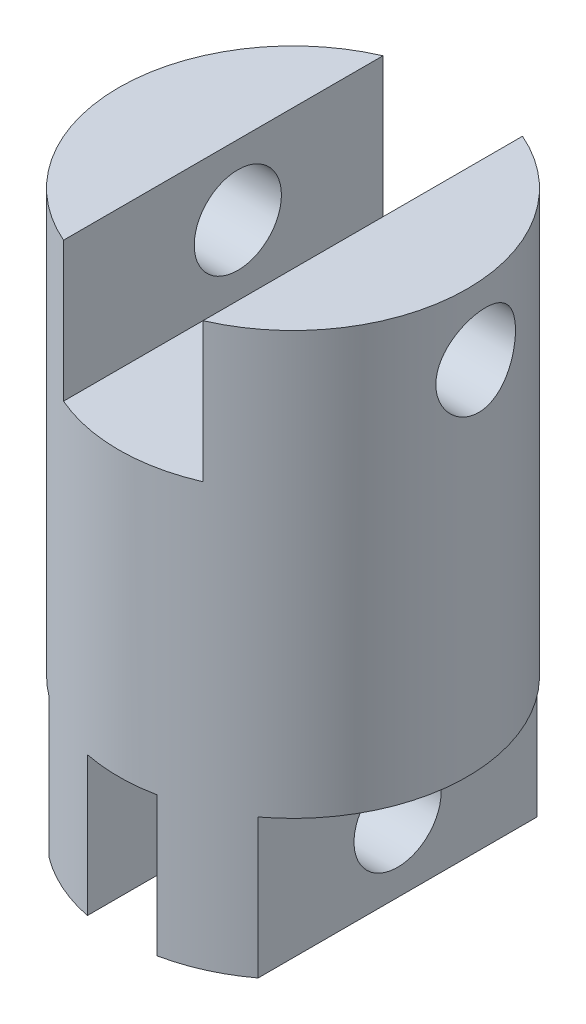
ISO-10303-21;
HEADER;
FILE_DESCRIPTION(('STEP AP214'),'2;1');
FILE_NAME('part.step','',(''),(''),'','','');
FILE_SCHEMA(('AUTOMOTIVE_DESIGN { 1 0 10303 214 1 1 1 1 }'));
ENDSEC;
DATA;
#1=APPLICATION_CONTEXT('core data for automotive mechanical design processes');
#2=APPLICATION_PROTOCOL_DEFINITION('international standard','automotive_design',2000,#1);
#3=PRODUCT_CONTEXT('',#1,'mechanical');
#4=PRODUCT('Part','Part','',(#3));
#5=PRODUCT_RELATED_PRODUCT_CATEGORY('part','',(#4));
#6=PRODUCT_DEFINITION_FORMATION('','',#4);
#7=PRODUCT_DEFINITION_CONTEXT('part definition',#1,'design');
#8=PRODUCT_DEFINITION('design','',#6,#7);
#9=PRODUCT_DEFINITION_SHAPE('','',#8);
#10=(LENGTH_UNIT() NAMED_UNIT(*) SI_UNIT(.MILLI.,.METRE.));
#11=(NAMED_UNIT(*) PLANE_ANGLE_UNIT() SI_UNIT($,.RADIAN.));
#12=(NAMED_UNIT(*) SI_UNIT($,.STERADIAN.) SOLID_ANGLE_UNIT());
#13=UNCERTAINTY_MEASURE_WITH_UNIT(LENGTH_MEASURE(1.E-05),#10,'distance_accuracy_value','');
#14=(GEOMETRIC_REPRESENTATION_CONTEXT(3) GLOBAL_UNCERTAINTY_ASSIGNED_CONTEXT((#13)) GLOBAL_UNIT_ASSIGNED_CONTEXT((#10,
#11,#12)) REPRESENTATION_CONTEXT('',''));
#15=CARTESIAN_POINT('',(0.,0.,0.));
#16=DIRECTION('',(0.,0.,1.));
#17=DIRECTION('',(1.,0.,0.));
#18=AXIS2_PLACEMENT_3D('',#15,#16,#17);
#19=CARTESIAN_POINT('',(0.,10.16,0.));
#20=DIRECTION('',(0.,-1.,0.));
#21=DIRECTION('',(0.,0.,-1.));
#22=AXIS2_PLACEMENT_3D('',#19,#20,#21);
#23=PLANE('',#22);
#24=CARTESIAN_POINT('',(0.,10.16,0.));
#25=DIRECTION('',(0.,-1.,0.));
#26=DIRECTION('',(0.,0.,-1.));
#27=AXIS2_PLACEMENT_3D('',#24,#25,#26);
#28=CIRCLE('',#27,2.54);
#29=CARTESIAN_POINT('',(2.54,10.16,0.));
#30=VERTEX_POINT('',#29);
#31=CARTESIAN_POINT('',(-2.54,10.16,0.));
#32=VERTEX_POINT('',#31);
#33=EDGE_CURVE('E57',#30,#32,#28,.T.);
#34=ORIENTED_EDGE('',*,*,#33,.F.);
#35=DIRECTION('',(0.,0.,1.));
#36=VECTOR('',#35,1.);
#37=CARTESIAN_POINT('',(2.54,10.16,12.4434078933385));
#38=LINE('',#37,#36);
#39=CARTESIAN_POINT('',(2.54,10.16,12.4434078933385));
#40=VERTEX_POINT('',#39);
#41=EDGE_CURVE('E148',#30,#40,#38,.T.);
#42=ORIENTED_EDGE('',*,*,#41,.T.);
#43=CARTESIAN_POINT('',(0.,10.16,0.));
#44=DIRECTION('',(0.,-1.,0.));
#45=DIRECTION('',(0.,0.,-1.));
#46=AXIS2_PLACEMENT_3D('',#43,#44,#45);
#47=CIRCLE('',#46,12.7);
#48=CARTESIAN_POINT('',(-2.54,10.16,12.4434078933385));
#49=VERTEX_POINT('',#48);
#50=EDGE_CURVE('E180',#40,#49,#47,.T.);
#51=ORIENTED_EDGE('',*,*,#50,.T.);
#52=DIRECTION('',(0.,0.,-1.));
#53=VECTOR('',#52,1.);
#54=CARTESIAN_POINT('',(-2.54,10.16,12.4434078933385));
#55=LINE('',#54,#53);
#56=EDGE_CURVE('E150',#49,#32,#55,.T.);
#57=ORIENTED_EDGE('',*,*,#56,.T.);
#58=EDGE_LOOP('',(#34,#42,#51,#57));
#59=FACE_BOUND('',#58,.T.);
#60=ADVANCED_FACE('F39',(#59),#23,.T.);
#61=CARTESIAN_POINT('',(0.,0.,0.));
#62=DIRECTION('',(0.,1.,0.));
#63=DIRECTION('',(0.,0.,1.));
#64=AXIS2_PLACEMENT_3D('',#61,#62,#63);
#65=PLANE('',#64);
#66=CARTESIAN_POINT('',(0.,0.,0.));
#67=DIRECTION('',(0.,1.,0.));
#68=DIRECTION('',(0.,0.,1.));
#69=AXIS2_PLACEMENT_3D('',#66,#67,#68);
#70=CIRCLE('',#69,12.7);
#71=CARTESIAN_POINT('',(7.62,0.,-10.16));
#72=VERTEX_POINT('',#71);
#73=CARTESIAN_POINT('',(2.54,0.,-12.4434078933385));
#74=VERTEX_POINT('',#73);
#75=EDGE_CURVE('E228',#72,#74,#70,.T.);
#76=ORIENTED_EDGE('',*,*,#75,.F.);
#77=DIRECTION('',(0.,0.,-1.));
#78=VECTOR('',#77,1.);
#79=CARTESIAN_POINT('',(7.62,0.,10.16));
#80=LINE('',#79,#78);
#81=CARTESIAN_POINT('',(7.62,0.,10.16));
#82=VERTEX_POINT('',#81);
#83=EDGE_CURVE('E462',#82,#72,#80,.T.);
#84=ORIENTED_EDGE('',*,*,#83,.F.);
#85=CARTESIAN_POINT('',(2.54,0.,12.4434078933385));
#86=VERTEX_POINT('',#85);
#87=EDGE_CURVE('E225',#86,#82,#70,.T.);
#88=ORIENTED_EDGE('',*,*,#87,.F.);
#89=DIRECTION('',(0.,0.,1.));
#90=VECTOR('',#89,1.);
#91=CARTESIAN_POINT('',(2.54,0.,12.4434078933385));
#92=LINE('',#91,#90);
#93=EDGE_CURVE('E176',#74,#86,#92,.T.);
#94=ORIENTED_EDGE('',*,*,#93,.F.);
#95=EDGE_LOOP('',(#76,#84,#88,#94));
#96=FACE_BOUND('',#95,.T.);
#97=ADVANCED_FACE('F321',(#96),#65,.F.);
#98=CARTESIAN_POINT('',(0.,40.9448,0.));
#99=DIRECTION('',(0.,1.,0.));
#100=DIRECTION('',(0.,0.,1.));
#101=AXIS2_PLACEMENT_3D('',#98,#99,#100);
#102=PLANE('',#101);
#103=DIRECTION('',(0.,0.,-1.));
#104=VECTOR('',#103,1.);
#105=CARTESIAN_POINT('',(5.08,40.9448,-11.6397422651878));
#106=LINE('',#105,#104);
#107=CARTESIAN_POINT('',(5.08,40.9448,11.6397422651878));
#108=VERTEX_POINT('',#107);
#109=CARTESIAN_POINT('',(5.08,40.9448,-11.6397422651878));
#110=VERTEX_POINT('',#109);
#111=EDGE_CURVE('E195',#108,#110,#106,.T.);
#112=ORIENTED_EDGE('',*,*,#111,.F.);
#113=CARTESIAN_POINT('',(0.,40.9448,0.));
#114=DIRECTION('',(0.,1.,0.));
#115=DIRECTION('',(0.,0.,1.));
#116=AXIS2_PLACEMENT_3D('',#113,#114,#115);
#117=CIRCLE('',#116,12.7);
#118=EDGE_CURVE('E11',#108,#110,#117,.T.);
#119=ORIENTED_EDGE('',*,*,#118,.T.);
#120=EDGE_LOOP('',(#112,#119));
#121=FACE_BOUND('',#120,.T.);
#122=ADVANCED_FACE('F318',(#121),#102,.T.);
#123=CARTESIAN_POINT('',(0.,40.9448,0.));
#124=DIRECTION('',(0.,-1.,0.));
#125=DIRECTION('',(0.,0.,-1.));
#126=AXIS2_PLACEMENT_3D('',#123,#124,#125);
#127=CYLINDRICAL_SURFACE('',#126,12.7);
#128=CARTESIAN_POINT('',(-11.9729942754398,35.8648,-4.23525773481216));
#129=CARTESIAN_POINT('',(-11.972998143231,36.0372088699793,-4.23525262688047));
#130=CARTESIAN_POINT('',(-11.9780095636609,36.2096716387249,-4.22116033774055));
#131=CARTESIAN_POINT('',(-11.9975381000863,36.5495584861729,-4.16532368016898));
#132=CARTESIAN_POINT('',(-12.0120610453909,36.7169794090304,-4.12356235408763));
#133=CARTESIAN_POINT('',(-12.0491026709913,37.0417317790422,-4.01402947263172));
#134=CARTESIAN_POINT('',(-12.0716053634372,37.1990826632751,-3.94630990417966));
#135=CARTESIAN_POINT('',(-12.1225134772368,37.5001390160573,-3.78703436072692));
#136=CARTESIAN_POINT('',(-12.1509195001857,37.6438430917147,-3.69547595612358));
#137=CARTESIAN_POINT('',(-12.2122375809538,37.9189029113476,-3.48760053710267));
#138=CARTESIAN_POINT('',(-12.2452690772457,38.0496806252469,-3.37055424702533));
#139=CARTESIAN_POINT('',(-12.3123252460539,38.2901286539601,-3.11670719723421));
#140=CARTESIAN_POINT('',(-12.3463501304767,38.3997944267882,-2.97990219772202));
#141=CARTESIAN_POINT('',(-12.4140105681662,38.5989575820938,-2.68442175676774));
#142=CARTESIAN_POINT('',(-12.4475844555827,38.6875519929203,-2.52512166018005));
#143=CARTESIAN_POINT('',(-12.5103683585746,38.8364406837887,-2.19299145152488));
#144=CARTESIAN_POINT('',(-12.5395787008088,38.8967370829698,-2.02016235372833));
#145=CARTESIAN_POINT('',(-12.5912063595523,38.9862781383189,-1.66815006049136));
#146=CARTESIAN_POINT('',(-12.6137091771629,39.0159266877327,-1.48908253104349));
#147=CARTESIAN_POINT('',(-12.6511326430744,39.0442481565371,-1.1277414626017));
#148=CARTESIAN_POINT('',(-12.6660551405096,39.0429286339528,-0.945468716719796));
#149=CARTESIAN_POINT('',(-12.687502188702,39.0096511538941,-0.589839174381925));
#150=CARTESIAN_POINT('',(-12.6943071431202,38.9787870590439,-0.416396168961094));
#151=CARTESIAN_POINT('',(-12.7009025881474,38.8887764996355,-0.0768813485584304));
#152=CARTESIAN_POINT('',(-12.7006934320317,38.8296314596344,0.0891908372431004));
#153=CARTESIAN_POINT('',(-12.6944494619133,38.6855231123991,0.407517676618822));
#154=CARTESIAN_POINT('',(-12.6884746565015,38.6008319251207,0.559897000299652));
#155=CARTESIAN_POINT('',(-12.6724411871112,38.4078173315897,0.848629743854683));
#156=CARTESIAN_POINT('',(-12.6623820966837,38.2994914581356,0.984981488337508));
#157=CARTESIAN_POINT('',(-12.6399450023049,38.0599932038052,1.24038360272859));
#158=CARTESIAN_POINT('',(-12.6275283040183,37.9284426207541,1.35907594892825));
#159=CARTESIAN_POINT('',(-12.6026728394593,37.6474575725587,1.57297969164506));
#160=CARTESIAN_POINT('',(-12.5902340715162,37.4980216911473,1.66818922682034));
#161=CARTESIAN_POINT('',(-12.5672199973432,37.1832267897036,1.83359700425444));
#162=CARTESIAN_POINT('',(-12.5566712082812,37.017684979229,1.90345162147138));
#163=CARTESIAN_POINT('',(-12.5393663956625,36.6770224799968,2.01431517082349));
#164=CARTESIAN_POINT('',(-12.5326100674525,36.5019025619015,2.05532642005016));
#165=CARTESIAN_POINT('',(-12.5240252803999,36.1487317891139,2.10700764995979));
#166=CARTESIAN_POINT('',(-12.522153025896,35.9707214875656,2.11794733148771));
#167=CARTESIAN_POINT('',(-12.5235086908234,35.6154030271458,2.10991610891844));
#168=CARTESIAN_POINT('',(-12.5267363756075,35.4380948363465,2.09094658093822));
#169=CARTESIAN_POINT('',(-12.5377268415192,35.090810040594,2.02398769375489));
#170=CARTESIAN_POINT('',(-12.5454499157718,34.9207830646111,1.97625228912676));
#171=CARTESIAN_POINT('',(-12.5641869147957,34.5911252293486,1.85338715501724));
#172=CARTESIAN_POINT('',(-12.5752011002728,34.4314951948851,1.77825525521383));
#173=CARTESIAN_POINT('',(-12.5988907917401,34.1254564931445,1.60184793217612));
#174=CARTESIAN_POINT('',(-12.6115813872154,33.9791912167403,1.50032579832561));
#175=CARTESIAN_POINT('',(-12.6364209016814,33.7056111156719,1.2742697449463));
#176=CARTESIAN_POINT('',(-12.6485697858979,33.5782975063512,1.14973435075678));
#177=CARTESIAN_POINT('',(-12.6702082162522,33.3451996482611,0.879916130503369));
#178=CARTESIAN_POINT('',(-12.6796754232026,33.2395981524221,0.734473411430744));
#179=CARTESIAN_POINT('',(-12.6937232389071,33.0543351376501,0.427697125983255));
#180=CARTESIAN_POINT('',(-12.6983044337287,32.9746705084367,0.266365467992196));
#181=CARTESIAN_POINT('',(-12.7008980430661,32.844624968811,-0.0650697601117389));
#182=CARTESIAN_POINT('',(-12.6990041825368,32.7938385379159,-0.235013384830998));
#183=CARTESIAN_POINT('',(-12.6878929986898,32.7212548363163,-0.580738734568135));
#184=CARTESIAN_POINT('',(-12.6786765922946,32.6994539369839,-0.75651972599577));
#185=CARTESIAN_POINT('',(-12.6529653817535,32.6854001781951,-1.1057164000628));
#186=CARTESIAN_POINT('',(-12.6365960407779,32.6926548441381,-1.27912193352732));
#187=CARTESIAN_POINT('',(-12.59721521882,32.7350707172644,-1.62170024605938));
#188=CARTESIAN_POINT('',(-12.5742033046118,32.7702337448816,-1.79087274826802));
#189=CARTESIAN_POINT('',(-12.5224926694032,32.8677703905291,-2.12267503769202));
#190=CARTESIAN_POINT('',(-12.4937243107253,32.9304897277952,-2.28519204203511));
#191=CARTESIAN_POINT('',(-12.4325932636365,33.0812430144316,-2.59729627846604));
#192=CARTESIAN_POINT('',(-12.4002298338348,33.1692821913372,-2.74688083221638));
#193=CARTESIAN_POINT('',(-12.3330308914859,33.3719011764706,-3.03462778093435));
#194=CARTESIAN_POINT('',(-12.2981483693459,33.4873166716735,-3.17219133352036));
#195=CARTESIAN_POINT('',(-12.2298307621258,33.7398965872704,-3.42615995674051));
#196=CARTESIAN_POINT('',(-12.1963960793602,33.8770670040099,-3.54255917477123));
#197=CARTESIAN_POINT('',(-12.1335200021671,34.1717016201651,-3.75231479730334));
#198=CARTESIAN_POINT('',(-12.1041368862798,34.3294089122513,-3.84534814010752));
#199=CARTESIAN_POINT('',(-12.0528509525061,34.6593931028246,-4.00321468640624));
#200=CARTESIAN_POINT('',(-12.030940906053,34.831655719757,-4.06807515772458));
#201=CARTESIAN_POINT('',(-12.0006301947048,35.1473903861465,-4.15650574206976));
#202=CARTESIAN_POINT('',(-11.9903349869687,35.2890581586002,-4.18596434639092));
#203=CARTESIAN_POINT('',(-11.9765158960221,35.575404922851,-4.22534106682629));
#204=CARTESIAN_POINT('',(-11.9729910288939,35.720083474009,-4.23526202230693));
#205=CARTESIAN_POINT('',(-11.9729942754398,35.8648,-4.23525773481216));
#206=B_SPLINE_CURVE_WITH_KNOTS('',3,(#128,#129,#130,#131,#132,#133,#134,#135,#136,#137,#138,
#139,#140,#141,#142,#143,#144,#145,#146,#147,#148,#149,#150,#151,#152,#153,#154,#155,#156,#157,
#158,#159,#160,#161,#162,#163,#164,#165,#166,#167,#168,#169,#170,#171,#172,#173,#174,#175,#176,
#177,#178,#179,#180,#181,#182,#183,#184,#185,#186,#187,#188,#189,#190,#191,#192,#193,#194,#195,
#196,#197,#198,#199,#200,#201,#202,#203,#204,#205),.UNSPECIFIED.,.T.,.F.,(4,2,2,2,2,2,2,2,2,2,2,
2,2,2,2,2,2,2,2,2,2,2,2,2,2,2,2,2,2,2,2,2,2,2,2,2,2,2,4),(0.,0.51668544272275,1.03368784210839,
1.54966019823544,2.06568516174838,2.59906942859476,3.13256831886256,3.68593121279239,
4.23925266069452,4.78518541322278,5.33098492753712,5.85732801387331,6.38364459024897,
6.90454171957706,7.42549325087814,7.95587865801775,8.48630609213286,9.02367514821774,
9.56100103058095,10.0934918632431,10.6259581968198,11.1537912344129,11.6816660954809,
12.2146653543448,12.7476987789798,13.2850500469275,13.8223368533809,14.3518796785743,
14.881356205347,15.4018967209428,15.9224711936572,16.4497720436397,16.9771818384299,
17.523430357678,18.0698297028281,18.6234125385423,19.1764583747285,19.6102167497306,
20.0439120828648),.UNSPECIFIED.);
#207=CARTESIAN_POINT('',(-11.9729942754398,35.8648,-4.23525773481216));
#208=VERTEX_POINT('',#207);
#209=EDGE_CURVE('E261',#208,#208,#206,.T.);
#210=ORIENTED_EDGE('',*,*,#209,.T.);
#211=EDGE_LOOP('',(#210));
#212=FACE_BOUND('',#211,.T.);
#213=CARTESIAN_POINT('',(11.9729942754398,35.8648,-4.23525773481216));
#214=CARTESIAN_POINT('',(11.972998143231,35.6923911300208,-4.23525262688047));
#215=CARTESIAN_POINT('',(11.9780095636609,35.5199283612751,-4.22116033774055));
#216=CARTESIAN_POINT('',(11.9975381000863,35.1800415138271,-4.16532368016898));
#217=CARTESIAN_POINT('',(12.0120610453909,35.0126205909696,-4.12356235408763));
#218=CARTESIAN_POINT('',(12.0491026709913,34.6878682209578,-4.01402947263172));
#219=CARTESIAN_POINT('',(12.0716053634372,34.5305173367249,-3.94630990417966));
#220=CARTESIAN_POINT('',(12.1225134772368,34.2294609839427,-3.78703436072692));
#221=CARTESIAN_POINT('',(12.1509195001857,34.0857569082853,-3.69547595612358));
#222=CARTESIAN_POINT('',(12.2122375809538,33.8106970886525,-3.48760053710267));
#223=CARTESIAN_POINT('',(12.2452690772457,33.6799193747531,-3.37055424702534));
#224=CARTESIAN_POINT('',(12.3123252460539,33.4394713460399,-3.11670719723422));
#225=CARTESIAN_POINT('',(12.3463501304767,33.3298055732118,-2.97990219772202));
#226=CARTESIAN_POINT('',(12.4140105681662,33.1306424179062,-2.68442175676774));
#227=CARTESIAN_POINT('',(12.4475844555827,33.0420480070797,-2.52512166018005));
#228=CARTESIAN_POINT('',(12.5103683585746,32.8931593162113,-2.19299145152488));
#229=CARTESIAN_POINT('',(12.5395787008088,32.8328629170302,-2.02016235372833));
#230=CARTESIAN_POINT('',(12.5912063595523,32.7433218616811,-1.66815006049136));
#231=CARTESIAN_POINT('',(12.6137091771629,32.7136733122673,-1.48908253104349));
#232=CARTESIAN_POINT('',(12.6511326430744,32.6853518434629,-1.1277414626017));
#233=CARTESIAN_POINT('',(12.6660551405096,32.6866713660472,-0.945468716719796));
#234=CARTESIAN_POINT('',(12.687502188702,32.7199488461059,-0.589839174381925));
#235=CARTESIAN_POINT('',(12.6943071431202,32.7508129409561,-0.416396168961094));
#236=CARTESIAN_POINT('',(12.7009025881474,32.8408235003645,-0.0768813485584304));
#237=CARTESIAN_POINT('',(12.7006934320317,32.8999685403656,0.0891908372431006));
#238=CARTESIAN_POINT('',(12.6944494619133,33.0440768876009,0.407517676618822));
#239=CARTESIAN_POINT('',(12.6884746565015,33.1287680748793,0.559897000299652));
#240=CARTESIAN_POINT('',(12.6724411871112,33.3217826684103,0.848629743854683));
#241=CARTESIAN_POINT('',(12.6623820966837,33.4301085418644,0.984981488337508));
#242=CARTESIAN_POINT('',(12.6399450023049,33.6696067961948,1.24038360272859));
#243=CARTESIAN_POINT('',(12.6275283040183,33.8011573792459,1.35907594892826));
#244=CARTESIAN_POINT('',(12.6026728394593,34.0821424274414,1.57297969164506));
#245=CARTESIAN_POINT('',(12.5902340715162,34.2315783088528,1.66818922682034));
#246=CARTESIAN_POINT('',(12.5672199973432,34.5463732102964,1.83359700425444));
#247=CARTESIAN_POINT('',(12.5566712082812,34.711915020771,1.90345162147138));
#248=CARTESIAN_POINT('',(12.5393663956625,35.0525775200032,2.01431517082349));
#249=CARTESIAN_POINT('',(12.5326100674525,35.2276974380985,2.05532642005016));
#250=CARTESIAN_POINT('',(12.5240252803999,35.5808682108861,2.10700764995979));
#251=CARTESIAN_POINT('',(12.522153025896,35.7588785124344,2.11794733148771));
#252=CARTESIAN_POINT('',(12.5235086908234,36.1141969728542,2.10991610891844));
#253=CARTESIAN_POINT('',(12.5267363756075,36.2915051636535,2.09094658093822));
#254=CARTESIAN_POINT('',(12.5377268415192,36.6387899594061,2.02398769375489));
#255=CARTESIAN_POINT('',(12.5454499157718,36.8088169353889,1.97625228912676));
#256=CARTESIAN_POINT('',(12.5641869147957,37.1384747706514,1.85338715501724));
#257=CARTESIAN_POINT('',(12.5752011002728,37.2981048051149,1.77825525521383));
#258=CARTESIAN_POINT('',(12.5988907917401,37.6041435068555,1.60184793217612));
#259=CARTESIAN_POINT('',(12.6115813872154,37.7504087832597,1.50032579832561));
#260=CARTESIAN_POINT('',(12.6364209016814,38.0239888843281,1.2742697449463));
#261=CARTESIAN_POINT('',(12.6485697858979,38.1513024936488,1.14973435075678));
#262=CARTESIAN_POINT('',(12.6702082162522,38.3844003517389,0.879916130503366));
#263=CARTESIAN_POINT('',(12.6796754232026,38.4900018475779,0.734473411430738));
#264=CARTESIAN_POINT('',(12.6937232389071,38.67526486235,0.427697125983249));
#265=CARTESIAN_POINT('',(12.6983044337287,38.7549294915633,0.266365467992192));
#266=CARTESIAN_POINT('',(12.7008980430661,38.884975031189,-0.0650697601117393));
#267=CARTESIAN_POINT('',(12.6990041825368,38.9357614620841,-0.235013384830998));
#268=CARTESIAN_POINT('',(12.6878929986898,39.0083451636837,-0.580738734568136));
#269=CARTESIAN_POINT('',(12.6786765922946,39.0301460630161,-0.756519725995771));
#270=CARTESIAN_POINT('',(12.6529653817535,39.0441998218049,-1.1057164000628));
#271=CARTESIAN_POINT('',(12.6365960407779,39.0369451558619,-1.27912193352732));
#272=CARTESIAN_POINT('',(12.59721521882,38.9945292827356,-1.62170024605938));
#273=CARTESIAN_POINT('',(12.5742033046118,38.9593662551184,-1.79087274826802));
#274=CARTESIAN_POINT('',(12.5224926694032,38.8618296094709,-2.12267503769202));
#275=CARTESIAN_POINT('',(12.4937243107253,38.7991102722048,-2.28519204203511));
#276=CARTESIAN_POINT('',(12.4325932636365,38.6483569855684,-2.59729627846604));
#277=CARTESIAN_POINT('',(12.4002298338348,38.5603178086628,-2.74688083221638));
#278=CARTESIAN_POINT('',(12.3330308914859,38.3576988235294,-3.03462778093435));
#279=CARTESIAN_POINT('',(12.2981483693459,38.2422833283265,-3.17219133352037));
#280=CARTESIAN_POINT('',(12.2298307621258,37.9897034127296,-3.42615995674051));
#281=CARTESIAN_POINT('',(12.1963960793602,37.8525329959901,-3.54255917477124));
#282=CARTESIAN_POINT('',(12.1335200021671,37.5578983798349,-3.75231479730335));
#283=CARTESIAN_POINT('',(12.1041368862798,37.4001910877487,-3.84534814010752));
#284=CARTESIAN_POINT('',(12.0528509525061,37.0702068971754,-4.00321468640624));
#285=CARTESIAN_POINT('',(12.030940906053,36.897944280243,-4.06807515772458));
#286=CARTESIAN_POINT('',(12.0006301947048,36.5822096138535,-4.15650574206976));
#287=CARTESIAN_POINT('',(11.9903349869687,36.4405418413998,-4.18596434639092));
#288=CARTESIAN_POINT('',(11.9765158960221,36.154195077149,-4.22534106682629));
#289=CARTESIAN_POINT('',(11.9729910288939,36.009516525991,-4.23526202230693));
#290=CARTESIAN_POINT('',(11.9729942754398,35.8648,-4.23525773481216));
#291=B_SPLINE_CURVE_WITH_KNOTS('',3,(#213,#214,#215,#216,#217,#218,#219,#220,#221,#222,#223,
#224,#225,#226,#227,#228,#229,#230,#231,#232,#233,#234,#235,#236,#237,#238,#239,#240,#241,#242,
#243,#244,#245,#246,#247,#248,#249,#250,#251,#252,#253,#254,#255,#256,#257,#258,#259,#260,#261,
#262,#263,#264,#265,#266,#267,#268,#269,#270,#271,#272,#273,#274,#275,#276,#277,#278,#279,#280,
#281,#282,#283,#284,#285,#286,#287,#288,#289,#290),.UNSPECIFIED.,.T.,.F.,(4,2,2,2,2,2,2,2,2,2,2,
2,2,2,2,2,2,2,2,2,2,2,2,2,2,2,2,2,2,2,2,2,2,2,2,2,2,2,4),(0.,0.51668544272275,1.03368784210839,
1.54966019823544,2.06568516174838,2.59906942859475,3.13256831886256,3.68593121279239,
4.23925266069452,4.78518541322278,5.33098492753712,5.85732801387331,6.38364459024897,
6.90454171957706,7.42549325087815,7.95587865801776,8.48630609213286,9.02367514821775,
9.56100103058096,10.0934918632431,10.6259581968198,11.1537912344129,11.681666095481,
12.2146653543448,12.7476987789798,13.2850500469275,13.8223368533809,14.3518796785743,
14.881356205347,15.4018967209428,15.9224711936572,16.4497720436397,16.9771818384299,
17.523430357678,18.0698297028282,18.6234125385423,19.1764583747285,19.6102167497306,
20.0439120828648),.UNSPECIFIED.);
#292=CARTESIAN_POINT('',(11.9729942754398,35.8648,-4.23525773481216));
#293=VERTEX_POINT('',#292);
#294=EDGE_CURVE('E253',#293,#293,#291,.T.);
#295=ORIENTED_EDGE('',*,*,#294,.T.);
#296=EDGE_LOOP('',(#295));
#297=FACE_BOUND('',#296,.T.);
#298=CARTESIAN_POINT('',(0.,10.16,0.));
#299=DIRECTION('',(0.,-1.,0.));
#300=DIRECTION('',(0.,0.,-1.));
#301=AXIS2_PLACEMENT_3D('',#298,#299,#300);
#302=CIRCLE('',#301,12.7);
#303=CARTESIAN_POINT('',(7.62,10.16,-10.16));
#304=VERTEX_POINT('',#303);
#305=CARTESIAN_POINT('',(7.62,10.16,10.16));
#306=VERTEX_POINT('',#305);
#307=EDGE_CURVE('E419',#304,#306,#302,.T.);
#308=ORIENTED_EDGE('',*,*,#307,.F.);
#309=DIRECTION('',(0.,-1.,0.));
#310=VECTOR('',#309,1.);
#311=CARTESIAN_POINT('',(7.62,10.16,-10.16));
#312=LINE('',#311,#310);
#313=EDGE_CURVE('E458',#304,#72,#312,.T.);
#314=ORIENTED_EDGE('',*,*,#313,.T.);
#315=ORIENTED_EDGE('',*,*,#75,.T.);
#316=DIRECTION('',(0.,-1.,0.));
#317=VECTOR('',#316,1.);
#318=CARTESIAN_POINT('',(2.54,10.16,-12.4434078933385));
#319=LINE('',#318,#317);
#320=CARTESIAN_POINT('',(2.54,10.16,-12.4434078933385));
#321=VERTEX_POINT('',#320);
#322=EDGE_CURVE('E184',#321,#74,#319,.T.);
#323=ORIENTED_EDGE('',*,*,#322,.F.);
#324=CARTESIAN_POINT('',(0.,10.16,0.));
#325=DIRECTION('',(0.,-1.,0.));
#326=DIRECTION('',(0.,0.,-1.));
#327=AXIS2_PLACEMENT_3D('',#324,#325,#326);
#328=CIRCLE('',#327,12.7);
#329=CARTESIAN_POINT('',(-2.54,10.16,-12.4434078933385));
#330=VERTEX_POINT('',#329);
#331=EDGE_CURVE('E162',#330,#321,#328,.T.);
#332=ORIENTED_EDGE('',*,*,#331,.F.);
#333=DIRECTION('',(0.,-1.,0.));
#334=VECTOR('',#333,1.);
#335=CARTESIAN_POINT('',(-2.54,10.16,-12.4434078933385));
#336=LINE('',#335,#334);
#337=CARTESIAN_POINT('',(-2.54,0.,-12.4434078933385));
#338=VERTEX_POINT('',#337);
#339=EDGE_CURVE('E168',#330,#338,#336,.T.);
#340=ORIENTED_EDGE('',*,*,#339,.T.);
#341=CARTESIAN_POINT('',(-7.62,0.,-10.16));
#342=VERTEX_POINT('',#341);
#343=EDGE_CURVE('E437',#338,#342,#70,.T.);
#344=ORIENTED_EDGE('',*,*,#343,.T.);
#345=DIRECTION('',(0.,-1.,0.));
#346=VECTOR('',#345,1.);
#347=CARTESIAN_POINT('',(-7.62,10.16,-10.16));
#348=LINE('',#347,#346);
#349=CARTESIAN_POINT('',(-7.62,10.16,-10.16));
#350=VERTEX_POINT('',#349);
#351=EDGE_CURVE('E470',#350,#342,#348,.T.);
#352=ORIENTED_EDGE('',*,*,#351,.F.);
#353=CARTESIAN_POINT('',(0.,10.16,0.));
#354=DIRECTION('',(0.,-1.,0.));
#355=DIRECTION('',(0.,0.,-1.));
#356=AXIS2_PLACEMENT_3D('',#353,#354,#355);
#357=CIRCLE('',#356,12.7);
#358=CARTESIAN_POINT('',(-7.62,10.16,10.16));
#359=VERTEX_POINT('',#358);
#360=EDGE_CURVE('E478',#359,#350,#357,.T.);
#361=ORIENTED_EDGE('',*,*,#360,.F.);
#362=DIRECTION('',(0.,-1.,0.));
#363=VECTOR('',#362,1.);
#364=CARTESIAN_POINT('',(-7.62,10.16,10.16));
#365=LINE('',#364,#363);
#366=CARTESIAN_POINT('',(-7.62,0.,10.16));
#367=VERTEX_POINT('',#366);
#368=EDGE_CURVE('E177',#359,#367,#365,.T.);
#369=ORIENTED_EDGE('',*,*,#368,.T.);
#370=CARTESIAN_POINT('',(-2.54,0.,12.4434078933385));
#371=VERTEX_POINT('',#370);
#372=EDGE_CURVE('E215',#367,#371,#70,.T.);
#373=ORIENTED_EDGE('',*,*,#372,.T.);
#374=DIRECTION('',(0.,-1.,0.));
#375=VECTOR('',#374,1.);
#376=CARTESIAN_POINT('',(-2.54,10.16,12.4434078933385));
#377=LINE('',#376,#375);
#378=EDGE_CURVE('E65',#49,#371,#377,.T.);
#379=ORIENTED_EDGE('',*,*,#378,.F.);
#380=ORIENTED_EDGE('',*,*,#50,.F.);
#381=DIRECTION('',(0.,-1.,0.));
#382=VECTOR('',#381,1.);
#383=CARTESIAN_POINT('',(2.54,10.16,12.4434078933385));
#384=LINE('',#383,#382);
#385=EDGE_CURVE('E159',#40,#86,#384,.T.);
#386=ORIENTED_EDGE('',*,*,#385,.T.);
#387=ORIENTED_EDGE('',*,*,#87,.T.);
#388=DIRECTION('',(0.,-1.,0.));
#389=VECTOR('',#388,1.);
#390=CARTESIAN_POINT('',(7.62,10.16,10.16));
#391=LINE('',#390,#389);
#392=EDGE_CURVE('E455',#306,#82,#391,.T.);
#393=ORIENTED_EDGE('',*,*,#392,.F.);
#394=EDGE_LOOP('',(#308,#314,#315,#323,#332,#340,#344,#352,#361,#369,#373,#379,#380,#386,#387,#393));
#395=FACE_BOUND('',#394,.T.);
#396=CARTESIAN_POINT('',(0.,30.7848,0.));
#397=DIRECTION('',(0.,1.,0.));
#398=DIRECTION('',(0.,0.,1.));
#399=AXIS2_PLACEMENT_3D('',#396,#397,#398);
#400=CIRCLE('',#399,12.7);
#401=CARTESIAN_POINT('',(5.08,30.7848,-11.6397422651878));
#402=VERTEX_POINT('',#401);
#403=CARTESIAN_POINT('',(-5.08,30.7848,-11.6397422651878));
#404=VERTEX_POINT('',#403);
#405=EDGE_CURVE('E190',#402,#404,#400,.T.);
#406=ORIENTED_EDGE('',*,*,#405,.F.);
#407=DIRECTION('',(0.,1.,0.));
#408=VECTOR('',#407,1.);
#409=CARTESIAN_POINT('',(5.08,30.7848,-11.6397422651878));
#410=LINE('',#409,#408);
#411=EDGE_CURVE('E211',#402,#110,#410,.T.);
#412=ORIENTED_EDGE('',*,*,#411,.T.);
#413=ORIENTED_EDGE('',*,*,#118,.F.);
#414=DIRECTION('',(0.,1.,0.));
#415=VECTOR('',#414,1.);
#416=CARTESIAN_POINT('',(5.08,30.7848,11.6397422651878));
#417=LINE('',#416,#415);
#418=CARTESIAN_POINT('',(5.08,30.7848,11.6397422651878));
#419=VERTEX_POINT('',#418);
#420=EDGE_CURVE('E216',#419,#108,#417,.T.);
#421=ORIENTED_EDGE('',*,*,#420,.F.);
#422=CARTESIAN_POINT('',(0.,30.7848,0.));
#423=DIRECTION('',(0.,1.,0.));
#424=DIRECTION('',(0.,0.,1.));
#425=AXIS2_PLACEMENT_3D('',#422,#423,#424);
#426=CIRCLE('',#425,12.7);
#427=CARTESIAN_POINT('',(-5.08,30.7848,11.6397422651878));
#428=VERTEX_POINT('',#427);
#429=EDGE_CURVE('E199',#428,#419,#426,.T.);
#430=ORIENTED_EDGE('',*,*,#429,.F.);
#431=DIRECTION('',(0.,1.,0.));
#432=VECTOR('',#431,1.);
#433=CARTESIAN_POINT('',(-5.08,30.7848,11.6397422651878));
#434=LINE('',#433,#432);
#435=CARTESIAN_POINT('',(-5.08,40.9448,11.6397422651878));
#436=VERTEX_POINT('',#435);
#437=EDGE_CURVE('E219',#428,#436,#434,.T.);
#438=ORIENTED_EDGE('',*,*,#437,.T.);
#439=CARTESIAN_POINT('',(-5.08,40.9448,-11.6397422651878));
#440=VERTEX_POINT('',#439);
#441=EDGE_CURVE('E50',#440,#436,#117,.T.);
#442=ORIENTED_EDGE('',*,*,#441,.F.);
#443=DIRECTION('',(0.,1.,0.));
#444=VECTOR('',#443,1.);
#445=CARTESIAN_POINT('',(-5.08,30.7848,-11.6397422651878));
#446=LINE('',#445,#444);
#447=EDGE_CURVE('E206',#404,#440,#446,.T.);
#448=ORIENTED_EDGE('',*,*,#447,.F.);
#449=EDGE_LOOP('',(#406,#412,#413,#421,#430,#438,#442,#448));
#450=FACE_BOUND('',#449,.T.);
#451=ADVANCED_FACE('F41',(#212,#297,#395,#450),#127,.T.);
#452=DIRECTION('',(0.,0.,1.));
#453=VECTOR('',#452,1.);
#454=CARTESIAN_POINT('',(-5.08,40.9448,-11.6397422651878));
#455=LINE('',#454,#453);
#456=EDGE_CURVE('E183',#440,#436,#455,.T.);
#457=ORIENTED_EDGE('',*,*,#456,.F.);
#458=ORIENTED_EDGE('',*,*,#441,.T.);
#459=EDGE_LOOP('',(#457,#458));
#460=FACE_BOUND('',#459,.T.);
#461=ADVANCED_FACE('F315',(#460),#102,.T.);
#462=ORIENTED_EDGE('',*,*,#372,.F.);
#463=DIRECTION('',(0.,0.,1.));
#464=VECTOR('',#463,1.);
#465=CARTESIAN_POINT('',(-7.62,0.,10.16));
#466=LINE('',#465,#464);
#467=EDGE_CURVE('E445',#342,#367,#466,.T.);
#468=ORIENTED_EDGE('',*,*,#467,.F.);
#469=ORIENTED_EDGE('',*,*,#343,.F.);
#470=DIRECTION('',(0.,0.,-1.));
#471=VECTOR('',#470,1.);
#472=CARTESIAN_POINT('',(-2.54,0.,12.4434078933385));
#473=LINE('',#472,#471);
#474=EDGE_CURVE('E173',#371,#338,#473,.T.);
#475=ORIENTED_EDGE('',*,*,#474,.F.);
#476=EDGE_LOOP('',(#462,#468,#469,#475));
#477=FACE_BOUND('',#476,.T.);
#478=ADVANCED_FACE('F310',(#477),#65,.F.);
#479=CARTESIAN_POINT('',(5.08,30.7848,-11.6397422651878));
#480=DIRECTION('',(1.,0.,0.));
#481=DIRECTION('',(0.,0.,-1.));
#482=AXIS2_PLACEMENT_3D('',#479,#480,#481);
#483=PLANE('',#482);
#484=CARTESIAN_POINT('',(5.08,35.8648,-1.06025773481217));
#485=DIRECTION('',(1.,0.,0.));
#486=DIRECTION('',(0.,0.,-1.));
#487=AXIS2_PLACEMENT_3D('',#484,#485,#486);
#488=CIRCLE('',#487,3.17499999999999);
#489=CARTESIAN_POINT('',(5.08,35.8648,-4.23525773481216));
#490=VERTEX_POINT('',#489);
#491=EDGE_CURVE('E249',#490,#490,#488,.T.);
#492=ORIENTED_EDGE('',*,*,#491,.T.);
#493=EDGE_LOOP('',(#492));
#494=FACE_BOUND('',#493,.T.);
#495=ORIENTED_EDGE('',*,*,#111,.T.);
#496=ORIENTED_EDGE('',*,*,#411,.F.);
#497=DIRECTION('',(0.,0.,-1.));
#498=VECTOR('',#497,1.);
#499=CARTESIAN_POINT('',(5.08,30.7848,-11.6397422651878));
#500=LINE('',#499,#498);
#501=EDGE_CURVE('E202',#419,#402,#500,.T.);
#502=ORIENTED_EDGE('',*,*,#501,.F.);
#503=ORIENTED_EDGE('',*,*,#420,.T.);
#504=EDGE_LOOP('',(#495,#496,#502,#503));
#505=FACE_BOUND('',#504,.T.);
#506=ADVANCED_FACE('F307',(#494,#505),#483,.F.);
#507=CARTESIAN_POINT('',(-5.08,30.7848,-11.6397422651878));
#508=DIRECTION('',(-1.,0.,0.));
#509=DIRECTION('',(0.,0.,1.));
#510=AXIS2_PLACEMENT_3D('',#507,#508,#509);
#511=PLANE('',#510);
#512=CARTESIAN_POINT('',(-5.08,35.8648,-1.06025773481217));
#513=DIRECTION('',(-1.,0.,0.));
#514=DIRECTION('',(0.,0.,1.));
#515=AXIS2_PLACEMENT_3D('',#512,#513,#514);
#516=CIRCLE('',#515,3.17499999999999);
#517=CARTESIAN_POINT('',(-5.08,35.8648,2.11474226518783));
#518=VERTEX_POINT('',#517);
#519=EDGE_CURVE('E44',#518,#518,#516,.T.);
#520=ORIENTED_EDGE('',*,*,#519,.T.);
#521=EDGE_LOOP('',(#520));
#522=FACE_BOUND('',#521,.T.);
#523=ORIENTED_EDGE('',*,*,#456,.T.);
#524=ORIENTED_EDGE('',*,*,#437,.F.);
#525=DIRECTION('',(0.,0.,1.));
#526=VECTOR('',#525,1.);
#527=CARTESIAN_POINT('',(-5.08,30.7848,-11.6397422651878));
#528=LINE('',#527,#526);
#529=EDGE_CURVE('E194',#404,#428,#528,.T.);
#530=ORIENTED_EDGE('',*,*,#529,.F.);
#531=ORIENTED_EDGE('',*,*,#447,.T.);
#532=EDGE_LOOP('',(#523,#524,#530,#531));
#533=FACE_BOUND('',#532,.T.);
#534=ADVANCED_FACE('F305',(#522,#533),#511,.F.);
#535=CARTESIAN_POINT('',(0.,30.7848,0.));
#536=DIRECTION('',(0.,1.,0.));
#537=DIRECTION('',(0.,0.,1.));
#538=AXIS2_PLACEMENT_3D('',#535,#536,#537);
#539=PLANE('',#538);
#540=CARTESIAN_POINT('',(0.,30.7848,0.));
#541=DIRECTION('',(0.,1.,0.));
#542=DIRECTION('',(0.,0.,1.));
#543=AXIS2_PLACEMENT_3D('',#540,#541,#542);
#544=CIRCLE('',#543,2.54);
#545=CARTESIAN_POINT('',(0.,30.7848,2.54));
#546=VERTEX_POINT('',#545);
#547=EDGE_CURVE('E142',#546,#546,#544,.T.);
#548=ORIENTED_EDGE('',*,*,#547,.F.);
#549=EDGE_LOOP('',(#548));
#550=FACE_BOUND('',#549,.T.);
#551=ORIENTED_EDGE('',*,*,#405,.T.);
#552=ORIENTED_EDGE('',*,*,#529,.T.);
#553=ORIENTED_EDGE('',*,*,#429,.T.);
#554=ORIENTED_EDGE('',*,*,#501,.T.);
#555=EDGE_LOOP('',(#551,#552,#553,#554));
#556=FACE_BOUND('',#555,.T.);
#557=ADVANCED_FACE('F298',(#550,#556),#539,.T.);
#558=CARTESIAN_POINT('',(2.54,10.16,12.4434078933385));
#559=DIRECTION('',(1.,0.,0.));
#560=DIRECTION('',(0.,0.,-1.));
#561=AXIS2_PLACEMENT_3D('',#558,#559,#560);
#562=PLANE('',#561);
#563=CARTESIAN_POINT('',(2.54,5.08,0.));
#564=DIRECTION('',(1.,0.,0.));
#565=DIRECTION('',(0.,0.,-1.));
#566=AXIS2_PLACEMENT_3D('',#563,#564,#565);
#567=CIRCLE('',#566,3.175);
#568=CARTESIAN_POINT('',(2.54,5.08,-3.175));
#569=VERTEX_POINT('',#568);
#570=EDGE_CURVE('E242',#569,#569,#567,.T.);
#571=ORIENTED_EDGE('',*,*,#570,.T.);
#572=EDGE_LOOP('',(#571));
#573=FACE_BOUND('',#572,.T.);
#574=ORIENTED_EDGE('',*,*,#93,.T.);
#575=ORIENTED_EDGE('',*,*,#385,.F.);
#576=ORIENTED_EDGE('',*,*,#41,.F.);
#577=EDGE_CURVE('E156',#321,#30,#38,.T.);
#578=ORIENTED_EDGE('',*,*,#577,.F.);
#579=ORIENTED_EDGE('',*,*,#322,.T.);
#580=EDGE_LOOP('',(#574,#575,#576,#578,#579));
#581=FACE_BOUND('',#580,.T.);
#582=ADVANCED_FACE('F155',(#573,#581),#562,.F.);
#583=CARTESIAN_POINT('',(-2.54,10.16,12.4434078933385));
#584=DIRECTION('',(-1.,0.,0.));
#585=DIRECTION('',(0.,0.,1.));
#586=AXIS2_PLACEMENT_3D('',#583,#584,#585);
#587=PLANE('',#586);
#588=CARTESIAN_POINT('',(-2.54,5.08,0.));
#589=DIRECTION('',(-1.,0.,0.));
#590=DIRECTION('',(0.,0.,1.));
#591=AXIS2_PLACEMENT_3D('',#588,#589,#590);
#592=CIRCLE('',#591,3.175);
#593=CARTESIAN_POINT('',(-2.54,5.08,-3.175));
#594=VERTEX_POINT('',#593);
#595=EDGE_CURVE('E236',#594,#594,#592,.T.);
#596=ORIENTED_EDGE('',*,*,#595,.T.);
#597=EDGE_LOOP('',(#596));
#598=FACE_BOUND('',#597,.T.);
#599=ORIENTED_EDGE('',*,*,#474,.T.);
#600=ORIENTED_EDGE('',*,*,#339,.F.);
#601=EDGE_CURVE('E450',#32,#330,#55,.T.);
#602=ORIENTED_EDGE('',*,*,#601,.F.);
#603=ORIENTED_EDGE('',*,*,#56,.F.);
#604=ORIENTED_EDGE('',*,*,#378,.T.);
#605=EDGE_LOOP('',(#599,#600,#602,#603,#604));
#606=FACE_BOUND('',#605,.T.);
#607=ADVANCED_FACE('F295',(#598,#606),#587,.F.);
#608=EDGE_CURVE('E135',#32,#30,#28,.T.);
#609=ORIENTED_EDGE('',*,*,#608,.F.);
#610=ORIENTED_EDGE('',*,*,#601,.T.);
#611=ORIENTED_EDGE('',*,*,#331,.T.);
#612=ORIENTED_EDGE('',*,*,#577,.T.);
#613=EDGE_LOOP('',(#609,#610,#611,#612));
#614=FACE_BOUND('',#613,.T.);
#615=ADVANCED_FACE('F164',(#614),#23,.T.);
#616=CARTESIAN_POINT('',(-7.62,10.16,10.16));
#617=DIRECTION('',(1.,0.,0.));
#618=DIRECTION('',(0.,0.,-1.));
#619=AXIS2_PLACEMENT_3D('',#616,#617,#618);
#620=PLANE('',#619);
#621=CARTESIAN_POINT('',(-7.62,5.08,0.));
#622=DIRECTION('',(1.,0.,0.));
#623=DIRECTION('',(0.,0.,-1.));
#624=AXIS2_PLACEMENT_3D('',#621,#622,#623);
#625=CIRCLE('',#624,3.175);
#626=CARTESIAN_POINT('',(-7.62,5.08,-3.175));
#627=VERTEX_POINT('',#626);
#628=EDGE_CURVE('E231',#627,#627,#625,.T.);
#629=ORIENTED_EDGE('',*,*,#628,.T.);
#630=EDGE_LOOP('',(#629));
#631=FACE_BOUND('',#630,.T.);
#632=ORIENTED_EDGE('',*,*,#467,.T.);
#633=ORIENTED_EDGE('',*,*,#368,.F.);
#634=DIRECTION('',(0.,0.,1.));
#635=VECTOR('',#634,1.);
#636=CARTESIAN_POINT('',(-7.62,10.16,10.16));
#637=LINE('',#636,#635);
#638=EDGE_CURVE('E473',#350,#359,#637,.T.);
#639=ORIENTED_EDGE('',*,*,#638,.F.);
#640=ORIENTED_EDGE('',*,*,#351,.T.);
#641=EDGE_LOOP('',(#632,#633,#639,#640));
#642=FACE_BOUND('',#641,.T.);
#643=ADVANCED_FACE('F284',(#631,#642),#620,.F.);
#644=CARTESIAN_POINT('',(0.,10.16,0.));
#645=DIRECTION('',(0.,-1.,0.));
#646=DIRECTION('',(0.,0.,-1.));
#647=AXIS2_PLACEMENT_3D('',#644,#645,#646);
#648=PLANE('',#647);
#649=ORIENTED_EDGE('',*,*,#360,.T.);
#650=ORIENTED_EDGE('',*,*,#638,.T.);
#651=EDGE_LOOP('',(#649,#650));
#652=FACE_BOUND('',#651,.T.);
#653=ADVANCED_FACE('F280',(#652),#648,.T.);
#654=CARTESIAN_POINT('',(7.62,10.16,10.16));
#655=DIRECTION('',(-1.,0.,0.));
#656=DIRECTION('',(0.,0.,1.));
#657=AXIS2_PLACEMENT_3D('',#654,#655,#656);
#658=PLANE('',#657);
#659=CARTESIAN_POINT('',(7.62,5.08,0.));
#660=DIRECTION('',(-1.,0.,0.));
#661=DIRECTION('',(0.,0.,1.));
#662=AXIS2_PLACEMENT_3D('',#659,#660,#661);
#663=CIRCLE('',#662,3.175);
#664=CARTESIAN_POINT('',(7.62,5.08,-3.175));
#665=VERTEX_POINT('',#664);
#666=EDGE_CURVE('E152',#665,#665,#663,.T.);
#667=ORIENTED_EDGE('',*,*,#666,.T.);
#668=EDGE_LOOP('',(#667));
#669=FACE_BOUND('',#668,.T.);
#670=ORIENTED_EDGE('',*,*,#83,.T.);
#671=ORIENTED_EDGE('',*,*,#313,.F.);
#672=DIRECTION('',(0.,0.,-1.));
#673=VECTOR('',#672,1.);
#674=CARTESIAN_POINT('',(7.62,10.16,10.16));
#675=LINE('',#674,#673);
#676=EDGE_CURVE('E459',#306,#304,#675,.T.);
#677=ORIENTED_EDGE('',*,*,#676,.F.);
#678=ORIENTED_EDGE('',*,*,#392,.T.);
#679=EDGE_LOOP('',(#670,#671,#677,#678));
#680=FACE_BOUND('',#679,.T.);
#681=ADVANCED_FACE('F283',(#669,#680),#658,.F.);
#682=CARTESIAN_POINT('',(0.,10.16,0.));
#683=DIRECTION('',(0.,-1.,0.));
#684=DIRECTION('',(0.,0.,-1.));
#685=AXIS2_PLACEMENT_3D('',#682,#683,#684);
#686=PLANE('',#685);
#687=ORIENTED_EDGE('',*,*,#307,.T.);
#688=ORIENTED_EDGE('',*,*,#676,.T.);
#689=EDGE_LOOP('',(#687,#688));
#690=FACE_BOUND('',#689,.T.);
#691=ADVANCED_FACE('F278',(#690),#686,.T.);
#692=CARTESIAN_POINT('',(-12.7,5.08,0.));
#693=DIRECTION('',(1.,0.,0.));
#694=DIRECTION('',(0.,0.,-1.));
#695=AXIS2_PLACEMENT_3D('',#692,#693,#694);
#696=CYLINDRICAL_SURFACE('',#695,3.175);
#697=CARTESIAN_POINT('',(7.62,5.08,-3.175));
#698=CARTESIAN_POINT('',(7.56708333333333,5.08,-3.175));
#699=CARTESIAN_POINT('',(7.51416666666667,5.08,-3.175));
#700=CARTESIAN_POINT('',(7.40833333333333,5.08,-3.175));
#701=CARTESIAN_POINT('',(7.35541666666667,5.08,-3.175));
#702=CARTESIAN_POINT('',(7.24958333333333,5.08,-3.175));
#703=CARTESIAN_POINT('',(7.19666666666667,5.08,-3.175));
#704=CARTESIAN_POINT('',(7.09083333333333,5.08,-3.175));
#705=CARTESIAN_POINT('',(7.03791666666667,5.08,-3.175));
#706=CARTESIAN_POINT('',(6.93208333333333,5.08,-3.175));
#707=CARTESIAN_POINT('',(6.87916666666667,5.08,-3.175));
#708=CARTESIAN_POINT('',(6.77333333333333,5.08,-3.175));
#709=CARTESIAN_POINT('',(6.72041666666667,5.08,-3.175));
#710=CARTESIAN_POINT('',(6.61458333333333,5.08,-3.175));
#711=CARTESIAN_POINT('',(6.56166666666667,5.08,-3.175));
#712=CARTESIAN_POINT('',(6.45583333333333,5.08,-3.175));
#713=CARTESIAN_POINT('',(6.40291666666667,5.08,-3.175));
#714=CARTESIAN_POINT('',(6.29708333333333,5.08,-3.175));
#715=CARTESIAN_POINT('',(6.24416666666667,5.08,-3.175));
#716=CARTESIAN_POINT('',(6.13833333333333,5.08,-3.175));
#717=CARTESIAN_POINT('',(6.08541666666667,5.08,-3.175));
#718=CARTESIAN_POINT('',(5.97958333333333,5.08,-3.175));
#719=CARTESIAN_POINT('',(5.92666666666667,5.08,-3.175));
#720=CARTESIAN_POINT('',(5.82083333333333,5.08,-3.175));
#721=CARTESIAN_POINT('',(5.76791666666667,5.08,-3.175));
#722=CARTESIAN_POINT('',(5.66208333333333,5.08,-3.175));
#723=CARTESIAN_POINT('',(5.60916666666667,5.08,-3.175));
#724=CARTESIAN_POINT('',(5.50333333333333,5.08,-3.175));
#725=CARTESIAN_POINT('',(5.45041666666666,5.08,-3.175));
#726=CARTESIAN_POINT('',(5.34458333333333,5.08,-3.175));
#727=CARTESIAN_POINT('',(5.29166666666667,5.08,-3.175));
#728=CARTESIAN_POINT('',(5.18583333333333,5.08,-3.175));
#729=CARTESIAN_POINT('',(5.13291666666667,5.08,-3.175));
#730=CARTESIAN_POINT('',(5.02708333333333,5.08,-3.175));
#731=CARTESIAN_POINT('',(4.97416666666667,5.08,-3.175));
#732=CARTESIAN_POINT('',(4.86833333333333,5.08,-3.175));
#733=CARTESIAN_POINT('',(4.81541666666667,5.08,-3.175));
#734=CARTESIAN_POINT('',(4.70958333333333,5.08,-3.175));
#735=CARTESIAN_POINT('',(4.65666666666667,5.08,-3.175));
#736=CARTESIAN_POINT('',(4.55083333333333,5.08,-3.175));
#737=CARTESIAN_POINT('',(4.49791666666667,5.08,-3.175));
#738=CARTESIAN_POINT('',(4.39208333333333,5.08,-3.175));
#739=CARTESIAN_POINT('',(4.33916666666667,5.08,-3.175));
#740=CARTESIAN_POINT('',(4.23333333333333,5.08,-3.175));
#741=CARTESIAN_POINT('',(4.18041666666667,5.08,-3.175));
#742=CARTESIAN_POINT('',(4.07458333333333,5.08,-3.175));
#743=CARTESIAN_POINT('',(4.02166666666666,5.08,-3.175));
#744=CARTESIAN_POINT('',(3.91583333333333,5.08,-3.175));
#745=CARTESIAN_POINT('',(3.86291666666667,5.08,-3.175));
#746=CARTESIAN_POINT('',(3.75708333333333,5.08,-3.175));
#747=CARTESIAN_POINT('',(3.70416666666667,5.08,-3.175));
#748=CARTESIAN_POINT('',(3.59833333333333,5.08,-3.175));
#749=CARTESIAN_POINT('',(3.54541666666667,5.08,-3.175));
#750=CARTESIAN_POINT('',(3.43958333333333,5.08,-3.175));
#751=CARTESIAN_POINT('',(3.38666666666667,5.08,-3.175));
#752=CARTESIAN_POINT('',(3.28083333333333,5.08,-3.175));
#753=CARTESIAN_POINT('',(3.22791666666667,5.08,-3.175));
#754=CARTESIAN_POINT('',(3.12208333333333,5.08,-3.175));
#755=CARTESIAN_POINT('',(3.06916666666667,5.08,-3.175));
#756=CARTESIAN_POINT('',(2.96333333333333,5.08,-3.175));
#757=CARTESIAN_POINT('',(2.91041666666667,5.08,-3.175));
#758=CARTESIAN_POINT('',(2.80458333333333,5.08,-3.175));
#759=CARTESIAN_POINT('',(2.75166666666667,5.08,-3.175));
#760=CARTESIAN_POINT('',(2.64583333333333,5.08,-3.175));
#761=CARTESIAN_POINT('',(2.59291666666667,5.08,-3.175));
#762=CARTESIAN_POINT('',(2.54,5.08,-3.175));
#763=B_SPLINE_CURVE_WITH_KNOTS('',3,(#697,#698,#699,#700,#701,#702,#703,#704,#705,#706,#707,
#708,#709,#710,#711,#712,#713,#714,#715,#716,#717,#718,#719,#720,#721,#722,#723,#724,#725,#726,
#727,#728,#729,#730,#731,#732,#733,#734,#735,#736,#737,#738,#739,#740,#741,#742,#743,#744,#745,
#746,#747,#748,#749,#750,#751,#752,#753,#754,#755,#756,#757,#758,#759,#760,#761,#762),
.UNSPECIFIED.,.F.,.F.,(4,2,2,2,2,2,2,2,2,2,2,2,2,2,2,2,2,2,2,2,2,2,2,2,2,2,2,2,2,2,2,2,4),(0.,
0.158749999999999,0.317499999999998,0.476250000000001,0.635,0.793749999999999,0.952500000000002,
1.11125,1.27,1.42875,1.5875,1.74625,1.905,2.06375,2.2225,2.38125,2.54,2.69875,2.8575,3.01625,
3.175,3.33375,3.4925,3.65125,3.81,3.96875,4.1275,4.28625,4.445,4.60375,4.7625,4.92125,5.08),.UNSPECIFIED.);
#764=EDGE_CURVE('BSEAM274',#665,#569,#763,.T.);
#765=ORIENTED_EDGE('',*,*,#666,.F.);
#766=ORIENTED_EDGE('',*,*,#570,.F.);
#767=ORIENTED_EDGE('',*,*,#764,.T.);
#768=ORIENTED_EDGE('',*,*,#764,.F.);
#769=EDGE_LOOP('',(#765,#767,#766,#768));
#770=FACE_BOUND('',#769,.T.);
#771=ADVANCED_FACE('F274',(#770),#696,.F.);
#772=CARTESIAN_POINT('',(-7.62,5.08,-3.175));
#773=CARTESIAN_POINT('',(-7.56708333333333,5.08,-3.175));
#774=CARTESIAN_POINT('',(-7.51416666666667,5.08,-3.175));
#775=CARTESIAN_POINT('',(-7.40833333333333,5.08,-3.175));
#776=CARTESIAN_POINT('',(-7.35541666666667,5.08,-3.175));
#777=CARTESIAN_POINT('',(-7.24958333333333,5.08,-3.175));
#778=CARTESIAN_POINT('',(-7.19666666666667,5.08,-3.175));
#779=CARTESIAN_POINT('',(-7.09083333333333,5.08,-3.175));
#780=CARTESIAN_POINT('',(-7.03791666666667,5.08,-3.175));
#781=CARTESIAN_POINT('',(-6.93208333333333,5.08,-3.175));
#782=CARTESIAN_POINT('',(-6.87916666666667,5.08,-3.175));
#783=CARTESIAN_POINT('',(-6.77333333333333,5.08,-3.175));
#784=CARTESIAN_POINT('',(-6.72041666666667,5.08,-3.175));
#785=CARTESIAN_POINT('',(-6.61458333333333,5.08,-3.175));
#786=CARTESIAN_POINT('',(-6.56166666666667,5.08,-3.175));
#787=CARTESIAN_POINT('',(-6.45583333333333,5.08,-3.175));
#788=CARTESIAN_POINT('',(-6.40291666666667,5.08,-3.175));
#789=CARTESIAN_POINT('',(-6.29708333333333,5.08,-3.175));
#790=CARTESIAN_POINT('',(-6.24416666666667,5.08,-3.175));
#791=CARTESIAN_POINT('',(-6.13833333333333,5.08,-3.175));
#792=CARTESIAN_POINT('',(-6.08541666666667,5.08,-3.175));
#793=CARTESIAN_POINT('',(-5.97958333333333,5.08,-3.175));
#794=CARTESIAN_POINT('',(-5.92666666666667,5.08,-3.175));
#795=CARTESIAN_POINT('',(-5.82083333333333,5.08,-3.175));
#796=CARTESIAN_POINT('',(-5.76791666666667,5.08,-3.175));
#797=CARTESIAN_POINT('',(-5.66208333333333,5.08,-3.175));
#798=CARTESIAN_POINT('',(-5.60916666666667,5.08,-3.175));
#799=CARTESIAN_POINT('',(-5.50333333333333,5.08,-3.175));
#800=CARTESIAN_POINT('',(-5.45041666666667,5.08,-3.175));
#801=CARTESIAN_POINT('',(-5.34458333333333,5.08,-3.175));
#802=CARTESIAN_POINT('',(-5.29166666666667,5.08,-3.175));
#803=CARTESIAN_POINT('',(-5.18583333333333,5.08,-3.175));
#804=CARTESIAN_POINT('',(-5.13291666666666,5.08,-3.175));
#805=CARTESIAN_POINT('',(-5.02708333333333,5.08,-3.175));
#806=CARTESIAN_POINT('',(-4.97416666666667,5.08,-3.175));
#807=CARTESIAN_POINT('',(-4.86833333333333,5.08,-3.175));
#808=CARTESIAN_POINT('',(-4.81541666666667,5.08,-3.175));
#809=CARTESIAN_POINT('',(-4.70958333333333,5.08,-3.175));
#810=CARTESIAN_POINT('',(-4.65666666666667,5.08,-3.175));
#811=CARTESIAN_POINT('',(-4.55083333333333,5.08,-3.175));
#812=CARTESIAN_POINT('',(-4.49791666666667,5.08,-3.175));
#813=CARTESIAN_POINT('',(-4.39208333333333,5.08,-3.175));
#814=CARTESIAN_POINT('',(-4.33916666666667,5.08,-3.175));
#815=CARTESIAN_POINT('',(-4.23333333333333,5.08,-3.175));
#816=CARTESIAN_POINT('',(-4.18041666666667,5.08,-3.175));
#817=CARTESIAN_POINT('',(-4.07458333333333,5.08,-3.175));
#818=CARTESIAN_POINT('',(-4.02166666666667,5.08,-3.175));
#819=CARTESIAN_POINT('',(-3.91583333333333,5.08,-3.175));
#820=CARTESIAN_POINT('',(-3.86291666666666,5.08,-3.175));
#821=CARTESIAN_POINT('',(-3.75708333333333,5.08,-3.175));
#822=CARTESIAN_POINT('',(-3.70416666666666,5.08,-3.175));
#823=CARTESIAN_POINT('',(-3.59833333333333,5.08,-3.175));
#824=CARTESIAN_POINT('',(-3.54541666666667,5.08,-3.175));
#825=CARTESIAN_POINT('',(-3.43958333333333,5.08,-3.175));
#826=CARTESIAN_POINT('',(-3.38666666666666,5.08,-3.175));
#827=CARTESIAN_POINT('',(-3.28083333333333,5.08,-3.175));
#828=CARTESIAN_POINT('',(-3.22791666666666,5.08,-3.175));
#829=CARTESIAN_POINT('',(-3.12208333333333,5.08,-3.175));
#830=CARTESIAN_POINT('',(-3.06916666666666,5.08,-3.175));
#831=CARTESIAN_POINT('',(-2.96333333333333,5.08,-3.175));
#832=CARTESIAN_POINT('',(-2.91041666666666,5.08,-3.175));
#833=CARTESIAN_POINT('',(-2.80458333333333,5.08,-3.175));
#834=CARTESIAN_POINT('',(-2.75166666666666,5.08,-3.175));
#835=CARTESIAN_POINT('',(-2.64583333333333,5.08,-3.175));
#836=CARTESIAN_POINT('',(-2.59291666666666,5.08,-3.175));
#837=CARTESIAN_POINT('',(-2.54,5.08,-3.175));
#838=B_SPLINE_CURVE_WITH_KNOTS('',3,(#772,#773,#774,#775,#776,#777,#778,#779,#780,#781,#782,
#783,#784,#785,#786,#787,#788,#789,#790,#791,#792,#793,#794,#795,#796,#797,#798,#799,#800,#801,
#802,#803,#804,#805,#806,#807,#808,#809,#810,#811,#812,#813,#814,#815,#816,#817,#818,#819,#820,
#821,#822,#823,#824,#825,#826,#827,#828,#829,#830,#831,#832,#833,#834,#835,#836,#837),
.UNSPECIFIED.,.F.,.F.,(4,2,2,2,2,2,2,2,2,2,2,2,2,2,2,2,2,2,2,2,2,2,2,2,2,2,2,2,2,2,2,2,4),(0.,
0.15875,0.3175,0.47625,0.635,0.793750000000001,0.952500000000001,1.11125,1.27,1.42875,1.5875,
1.74625,1.905,2.06375,2.2225,2.38125,2.54,2.69875,2.8575,3.01625,3.175,3.33375,3.4925,3.65125,
3.81,3.96875,4.1275,4.28625,4.445,4.60375,4.7625,4.92125000000001,5.08),.UNSPECIFIED.);
#839=EDGE_CURVE('BSEAM272',#627,#594,#838,.T.);
#840=ORIENTED_EDGE('',*,*,#628,.F.);
#841=ORIENTED_EDGE('',*,*,#595,.F.);
#842=ORIENTED_EDGE('',*,*,#839,.T.);
#843=ORIENTED_EDGE('',*,*,#839,.F.);
#844=EDGE_LOOP('',(#840,#842,#841,#843));
#845=FACE_BOUND('',#844,.T.);
#846=ADVANCED_FACE('F272',(#845),#696,.F.);
#847=CARTESIAN_POINT('',(-12.7,35.8648,-1.06025773481217));
#848=DIRECTION('',(1.,0.,0.));
#849=DIRECTION('',(0.,0.,-1.));
#850=AXIS2_PLACEMENT_3D('',#847,#848,#849);
#851=CYLINDRICAL_SURFACE('',#850,3.17499999999999);
#852=ORIENTED_EDGE('',*,*,#519,.F.);
#853=EDGE_LOOP('',(#852));
#854=FACE_BOUND('',#853,.T.);
#855=ORIENTED_EDGE('',*,*,#209,.F.);
#856=EDGE_LOOP('',(#855));
#857=FACE_BOUND('',#856,.T.);
#858=ADVANCED_FACE('F266',(#854,#857),#851,.F.);
#859=ORIENTED_EDGE('',*,*,#491,.F.);
#860=EDGE_LOOP('',(#859));
#861=FACE_BOUND('',#860,.T.);
#862=ORIENTED_EDGE('',*,*,#294,.F.);
#863=EDGE_LOOP('',(#862));
#864=FACE_BOUND('',#863,.T.);
#865=ADVANCED_FACE('F271',(#861,#864),#851,.F.);
#866=CARTESIAN_POINT('',(0.,0.,0.));
#867=DIRECTION('',(0.,1.,0.));
#868=DIRECTION('',(0.,0.,1.));
#869=AXIS2_PLACEMENT_3D('',#866,#867,#868);
#870=CYLINDRICAL_SURFACE('',#869,2.54);
#871=ORIENTED_EDGE('',*,*,#33,.T.);
#872=ORIENTED_EDGE('',*,*,#608,.T.);
#873=EDGE_LOOP('',(#871,#872));
#874=FACE_BOUND('',#873,.T.);
#875=ORIENTED_EDGE('',*,*,#547,.T.);
#876=EDGE_LOOP('',(#875));
#877=FACE_BOUND('',#876,.T.);
#878=ADVANCED_FACE('F136',(#874,#877),#870,.F.);
#879=CLOSED_SHELL('',(#60,#97,#122,#451,#461,#478,#506,#534,#557,#582,#607,#615,#643,#653,#681,
#691,#771,#846,#858,#865,#878));
#880=MANIFOLD_SOLID_BREP('B2',#879);
#881=ADVANCED_BREP_SHAPE_REPRESENTATION('',(#18,#880),#14);
#882=SHAPE_DEFINITION_REPRESENTATION(#9,#881);
ENDSEC;
END-ISO-10303-21;
